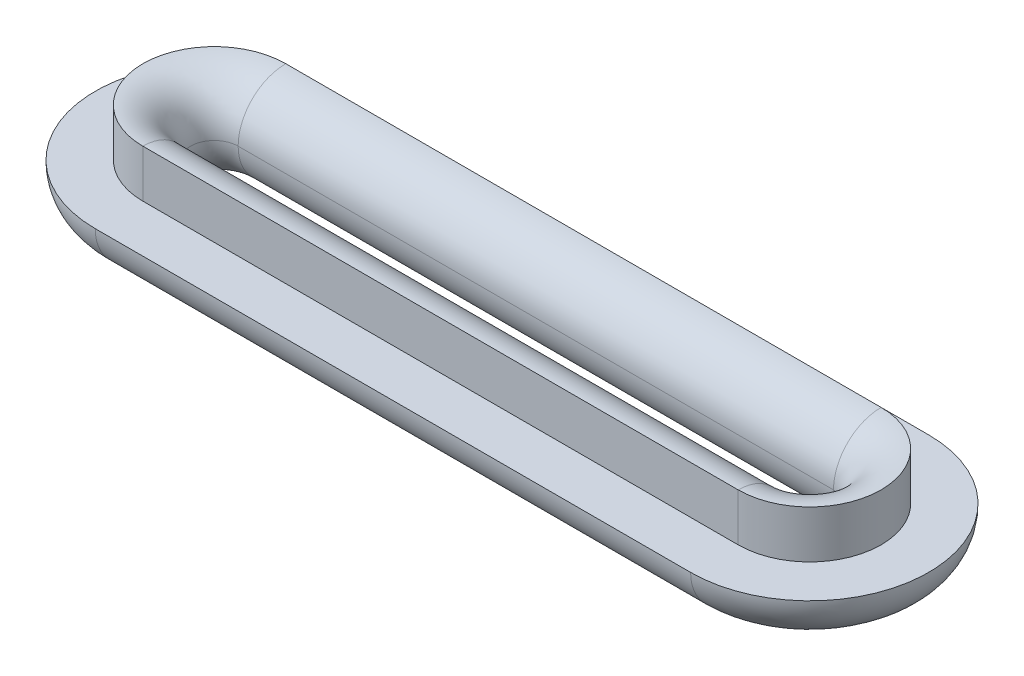
ISO-10303-21;
HEADER;
FILE_DESCRIPTION(('STEP AP214'),'2;1');
FILE_NAME('part.step','',(''),(''),'','','');
FILE_SCHEMA(('AUTOMOTIVE_DESIGN { 1 0 10303 214 1 1 1 1 }'));
ENDSEC;
DATA;
#1=APPLICATION_CONTEXT('core data for automotive mechanical design processes');
#2=APPLICATION_PROTOCOL_DEFINITION('international standard','automotive_design',2000,#1);
#3=PRODUCT_CONTEXT('',#1,'mechanical');
#4=PRODUCT('Part','Part','',(#3));
#5=PRODUCT_RELATED_PRODUCT_CATEGORY('part','',(#4));
#6=PRODUCT_DEFINITION_FORMATION('','',#4);
#7=PRODUCT_DEFINITION_CONTEXT('part definition',#1,'design');
#8=PRODUCT_DEFINITION('design','',#6,#7);
#9=PRODUCT_DEFINITION_SHAPE('','',#8);
#10=(LENGTH_UNIT() NAMED_UNIT(*) SI_UNIT(.MILLI.,.METRE.));
#11=(NAMED_UNIT(*) PLANE_ANGLE_UNIT() SI_UNIT($,.RADIAN.));
#12=(NAMED_UNIT(*) SI_UNIT($,.STERADIAN.) SOLID_ANGLE_UNIT());
#13=UNCERTAINTY_MEASURE_WITH_UNIT(LENGTH_MEASURE(1.E-05),#10,'distance_accuracy_value','');
#14=(GEOMETRIC_REPRESENTATION_CONTEXT(3) GLOBAL_UNCERTAINTY_ASSIGNED_CONTEXT((#13)) GLOBAL_UNIT_ASSIGNED_CONTEXT((#10,
#11,#12)) REPRESENTATION_CONTEXT('',''));
#15=CARTESIAN_POINT('',(0.,0.,0.));
#16=DIRECTION('',(0.,0.,1.));
#17=DIRECTION('',(1.,0.,0.));
#18=AXIS2_PLACEMENT_3D('',#15,#16,#17);
#19=CARTESIAN_POINT('',(-12.5,2.,0.));
#20=DIRECTION('',(0.,-1.,0.));
#21=DIRECTION('',(0.,0.,-1.));
#22=AXIS2_PLACEMENT_3D('',#19,#20,#21);
#23=CYLINDRICAL_SURFACE('',#22,3.);
#24=CARTESIAN_POINT('',(-12.5,0.,0.));
#25=DIRECTION('',(0.,1.,0.));
#26=DIRECTION('',(0.,0.,1.));
#27=AXIS2_PLACEMENT_3D('',#24,#25,#26);
#28=CIRCLE('',#27,3.);
#29=CARTESIAN_POINT('',(-12.5,0.,-3.));
#30=VERTEX_POINT('',#29);
#31=CARTESIAN_POINT('',(-12.5,0.,3.));
#32=VERTEX_POINT('',#31);
#33=EDGE_CURVE('E270',#30,#32,#28,.T.);
#34=ORIENTED_EDGE('',*,*,#33,.T.);
#35=DIRECTION('',(0.,-1.,0.));
#36=VECTOR('',#35,1.);
#37=CARTESIAN_POINT('',(-12.5,2.,3.));
#38=LINE('',#37,#36);
#39=CARTESIAN_POINT('',(-12.5,2.,3.));
#40=VERTEX_POINT('',#39);
#41=EDGE_CURVE('E12',#40,#32,#38,.T.);
#42=ORIENTED_EDGE('',*,*,#41,.F.);
#43=CARTESIAN_POINT('',(-12.5,2.,0.));
#44=DIRECTION('',(0.,1.,0.));
#45=DIRECTION('',(0.,0.,1.));
#46=AXIS2_PLACEMENT_3D('',#43,#44,#45);
#47=CIRCLE('',#46,3.);
#48=CARTESIAN_POINT('',(-12.5,2.,-3.));
#49=VERTEX_POINT('',#48);
#50=EDGE_CURVE('E271',#49,#40,#47,.T.);
#51=ORIENTED_EDGE('',*,*,#50,.F.);
#52=DIRECTION('',(0.,-1.,0.));
#53=VECTOR('',#52,1.);
#54=CARTESIAN_POINT('',(-12.5,2.,-3.));
#55=LINE('',#54,#53);
#56=EDGE_CURVE('E172',#49,#30,#55,.T.);
#57=ORIENTED_EDGE('',*,*,#56,.T.);
#58=EDGE_LOOP('',(#34,#42,#51,#57));
#59=FACE_BOUND('',#58,.T.);
#60=ADVANCED_FACE('F64',(#59),#23,.T.);
#61=CARTESIAN_POINT('',(-12.5,2.,3.));
#62=DIRECTION('',(0.,0.,-1.));
#63=DIRECTION('',(-1.,0.,0.));
#64=AXIS2_PLACEMENT_3D('',#61,#62,#63);
#65=PLANE('',#64);
#66=DIRECTION('',(1.,0.,0.));
#67=VECTOR('',#66,1.);
#68=CARTESIAN_POINT('',(-12.5,0.,3.));
#69=LINE('',#68,#67);
#70=CARTESIAN_POINT('',(12.5,0.,3.));
#71=VERTEX_POINT('',#70);
#72=EDGE_CURVE('E280',#32,#71,#69,.T.);
#73=ORIENTED_EDGE('',*,*,#72,.T.);
#74=DIRECTION('',(0.,-1.,0.));
#75=VECTOR('',#74,1.);
#76=CARTESIAN_POINT('',(12.5,2.,3.));
#77=LINE('',#76,#75);
#78=CARTESIAN_POINT('',(12.5,2.,3.));
#79=VERTEX_POINT('',#78);
#80=EDGE_CURVE('E75',#79,#71,#77,.T.);
#81=ORIENTED_EDGE('',*,*,#80,.F.);
#82=DIRECTION('',(1.,0.,0.));
#83=VECTOR('',#82,1.);
#84=CARTESIAN_POINT('',(-12.5,2.,3.));
#85=LINE('',#84,#83);
#86=EDGE_CURVE('E192',#40,#79,#85,.T.);
#87=ORIENTED_EDGE('',*,*,#86,.F.);
#88=ORIENTED_EDGE('',*,*,#41,.T.);
#89=EDGE_LOOP('',(#73,#81,#87,#88));
#90=FACE_BOUND('',#89,.T.);
#91=ADVANCED_FACE('F290',(#90),#65,.F.);
#92=CARTESIAN_POINT('',(12.5,2.,0.));
#93=DIRECTION('',(0.,-1.,0.));
#94=DIRECTION('',(0.,0.,-1.));
#95=AXIS2_PLACEMENT_3D('',#92,#93,#94);
#96=CYLINDRICAL_SURFACE('',#95,3.);
#97=CARTESIAN_POINT('',(12.5,0.,0.));
#98=DIRECTION('',(0.,1.,0.));
#99=DIRECTION('',(0.,0.,1.));
#100=AXIS2_PLACEMENT_3D('',#97,#98,#99);
#101=CIRCLE('',#100,3.);
#102=CARTESIAN_POINT('',(12.5,0.,-3.));
#103=VERTEX_POINT('',#102);
#104=EDGE_CURVE('E169',#71,#103,#101,.T.);
#105=ORIENTED_EDGE('',*,*,#104,.T.);
#106=DIRECTION('',(0.,-1.,0.));
#107=VECTOR('',#106,1.);
#108=CARTESIAN_POINT('',(12.5,2.,-3.));
#109=LINE('',#108,#107);
#110=CARTESIAN_POINT('',(12.5,2.,-3.));
#111=VERTEX_POINT('',#110);
#112=EDGE_CURVE('E163',#111,#103,#109,.T.);
#113=ORIENTED_EDGE('',*,*,#112,.F.);
#114=CARTESIAN_POINT('',(12.5,2.,0.));
#115=DIRECTION('',(0.,1.,0.));
#116=DIRECTION('',(0.,0.,1.));
#117=AXIS2_PLACEMENT_3D('',#114,#115,#116);
#118=CIRCLE('',#117,3.);
#119=EDGE_CURVE('E168',#79,#111,#118,.T.);
#120=ORIENTED_EDGE('',*,*,#119,.F.);
#121=ORIENTED_EDGE('',*,*,#80,.T.);
#122=EDGE_LOOP('',(#105,#113,#120,#121));
#123=FACE_BOUND('',#122,.T.);
#124=ADVANCED_FACE('F165',(#123),#96,.T.);
#125=CARTESIAN_POINT('',(-12.5,2.,-3.));
#126=DIRECTION('',(0.,0.,1.));
#127=DIRECTION('',(1.,0.,0.));
#128=AXIS2_PLACEMENT_3D('',#125,#126,#127);
#129=PLANE('',#128);
#130=DIRECTION('',(-1.,0.,0.));
#131=VECTOR('',#130,1.);
#132=CARTESIAN_POINT('',(-12.5,0.,-3.));
#133=LINE('',#132,#131);
#134=EDGE_CURVE('E275',#103,#30,#133,.T.);
#135=ORIENTED_EDGE('',*,*,#134,.T.);
#136=ORIENTED_EDGE('',*,*,#56,.F.);
#137=DIRECTION('',(-1.,0.,0.));
#138=VECTOR('',#137,1.);
#139=CARTESIAN_POINT('',(-12.5,2.,-3.));
#140=LINE('',#139,#138);
#141=EDGE_CURVE('E175',#111,#49,#140,.T.);
#142=ORIENTED_EDGE('',*,*,#141,.F.);
#143=ORIENTED_EDGE('',*,*,#112,.T.);
#144=EDGE_LOOP('',(#135,#136,#142,#143));
#145=FACE_BOUND('',#144,.T.);
#146=ADVANCED_FACE('F176',(#145),#129,.F.);
#147=CARTESIAN_POINT('',(-12.5,0.,0.));
#148=DIRECTION('',(0.,1.,0.));
#149=DIRECTION('',(0.,0.,1.));
#150=AXIS2_PLACEMENT_3D('',#147,#148,#149);
#151=TOROIDAL_SURFACE('',#150,3.,2.);
#152=CARTESIAN_POINT('',(-12.5,0.,-3.));
#153=DIRECTION('',(1.,0.,0.));
#154=DIRECTION('',(0.,0.,-1.));
#155=AXIS2_PLACEMENT_3D('',#152,#153,#154);
#156=CIRCLE('',#155,2.);
#157=CARTESIAN_POINT('',(-12.5,0.,-1.));
#158=VERTEX_POINT('',#157);
#159=EDGE_CURVE('E198',#49,#158,#156,.T.);
#160=ORIENTED_EDGE('',*,*,#159,.F.);
#161=ORIENTED_EDGE('',*,*,#50,.T.);
#162=CARTESIAN_POINT('',(-12.5,0.,3.));
#163=DIRECTION('',(1.,0.,0.));
#164=DIRECTION('',(0.,0.,-1.));
#165=AXIS2_PLACEMENT_3D('',#162,#163,#164);
#166=CIRCLE('',#165,2.);
#167=CARTESIAN_POINT('',(-12.5,0.,1.));
#168=VERTEX_POINT('',#167);
#169=EDGE_CURVE('E208',#168,#40,#166,.T.);
#170=ORIENTED_EDGE('',*,*,#169,.F.);
#171=CARTESIAN_POINT('',(-12.5,0.,0.));
#172=DIRECTION('',(0.,1.,0.));
#173=DIRECTION('',(1.,0.,0.));
#174=AXIS2_PLACEMENT_3D('',#171,#172,#173);
#175=CIRCLE('',#174,1.);
#176=EDGE_CURVE('E212',#158,#168,#175,.T.);
#177=ORIENTED_EDGE('',*,*,#176,.F.);
#178=EDGE_LOOP('',(#160,#161,#170,#177));
#179=FACE_BOUND('',#178,.T.);
#180=ADVANCED_FACE('F299',(#179),#151,.T.);
#181=CARTESIAN_POINT('',(-12.5,0.,3.));
#182=DIRECTION('',(1.,0.,0.));
#183=DIRECTION('',(0.,0.,-1.));
#184=AXIS2_PLACEMENT_3D('',#181,#182,#183);
#185=CYLINDRICAL_SURFACE('',#184,2.);
#186=ORIENTED_EDGE('',*,*,#169,.T.);
#187=ORIENTED_EDGE('',*,*,#86,.T.);
#188=CARTESIAN_POINT('',(12.5,0.,3.));
#189=DIRECTION('',(1.,0.,0.));
#190=DIRECTION('',(0.,0.,-1.));
#191=AXIS2_PLACEMENT_3D('',#188,#189,#190);
#192=CIRCLE('',#191,2.);
#193=CARTESIAN_POINT('',(12.5,0.,1.));
#194=VERTEX_POINT('',#193);
#195=EDGE_CURVE('E190',#194,#79,#192,.T.);
#196=ORIENTED_EDGE('',*,*,#195,.F.);
#197=DIRECTION('',(1.,0.,0.));
#198=VECTOR('',#197,1.);
#199=CARTESIAN_POINT('',(-12.5,0.,1.));
#200=LINE('',#199,#198);
#201=EDGE_CURVE('E262',#168,#194,#200,.T.);
#202=ORIENTED_EDGE('',*,*,#201,.F.);
#203=EDGE_LOOP('',(#186,#187,#196,#202));
#204=FACE_BOUND('',#203,.T.);
#205=ADVANCED_FACE('F336',(#204),#185,.T.);
#206=CARTESIAN_POINT('',(-12.5,0.,-3.));
#207=DIRECTION('',(-1.,0.,0.));
#208=DIRECTION('',(0.,0.,1.));
#209=AXIS2_PLACEMENT_3D('',#206,#207,#208);
#210=CYLINDRICAL_SURFACE('',#209,2.);
#211=ORIENTED_EDGE('',*,*,#159,.T.);
#212=DIRECTION('',(-1.,0.,0.));
#213=VECTOR('',#212,1.);
#214=CARTESIAN_POINT('',(-12.5,0.,-1.));
#215=LINE('',#214,#213);
#216=CARTESIAN_POINT('',(12.5,0.,-1.));
#217=VERTEX_POINT('',#216);
#218=EDGE_CURVE('E195',#217,#158,#215,.T.);
#219=ORIENTED_EDGE('',*,*,#218,.F.);
#220=CARTESIAN_POINT('',(12.5,0.,-3.));
#221=DIRECTION('',(1.,0.,0.));
#222=DIRECTION('',(0.,0.,-1.));
#223=AXIS2_PLACEMENT_3D('',#220,#221,#222);
#224=CIRCLE('',#223,2.);
#225=EDGE_CURVE('E188',#111,#217,#224,.T.);
#226=ORIENTED_EDGE('',*,*,#225,.F.);
#227=ORIENTED_EDGE('',*,*,#141,.T.);
#228=EDGE_LOOP('',(#211,#219,#226,#227));
#229=FACE_BOUND('',#228,.T.);
#230=ADVANCED_FACE('F194',(#229),#210,.T.);
#231=CARTESIAN_POINT('',(12.5,0.,0.));
#232=DIRECTION('',(0.,1.,0.));
#233=DIRECTION('',(0.,0.,1.));
#234=AXIS2_PLACEMENT_3D('',#231,#232,#233);
#235=TOROIDAL_SURFACE('',#234,3.,2.);
#236=ORIENTED_EDGE('',*,*,#195,.T.);
#237=ORIENTED_EDGE('',*,*,#119,.T.);
#238=ORIENTED_EDGE('',*,*,#225,.T.);
#239=CARTESIAN_POINT('',(12.5,0.,0.));
#240=DIRECTION('',(0.,1.,0.));
#241=DIRECTION('',(1.,0.,0.));
#242=AXIS2_PLACEMENT_3D('',#239,#240,#241);
#243=CIRCLE('',#242,1.);
#244=EDGE_CURVE('E266',#194,#217,#243,.T.);
#245=ORIENTED_EDGE('',*,*,#244,.F.);
#246=EDGE_LOOP('',(#236,#237,#238,#245));
#247=FACE_BOUND('',#246,.T.);
#248=ADVANCED_FACE('F186',(#247),#235,.T.);
#249=CARTESIAN_POINT('',(12.5,0.,0.));
#250=DIRECTION('',(0.,-1.,0.));
#251=DIRECTION('',(0.,0.,-1.));
#252=AXIS2_PLACEMENT_3D('',#249,#250,#251);
#253=PLANE('',#252);
#254=CARTESIAN_POINT('',(12.5,0.,0.));
#255=DIRECTION('',(0.,-1.,0.));
#256=DIRECTION('',(0.,0.,-1.));
#257=AXIS2_PLACEMENT_3D('',#254,#255,#256);
#258=CIRCLE('',#257,5.);
#259=CARTESIAN_POINT('',(12.5,0.,-5.));
#260=VERTEX_POINT('',#259);
#261=CARTESIAN_POINT('',(12.5,0.,5.));
#262=VERTEX_POINT('',#261);
#263=EDGE_CURVE('E252',#260,#262,#258,.T.);
#264=ORIENTED_EDGE('',*,*,#263,.F.);
#265=DIRECTION('',(1.,0.,0.));
#266=VECTOR('',#265,1.);
#267=CARTESIAN_POINT('',(12.5,0.,-5.));
#268=LINE('',#267,#266);
#269=CARTESIAN_POINT('',(-12.5,0.,-5.));
#270=VERTEX_POINT('',#269);
#271=EDGE_CURVE('E196',#270,#260,#268,.T.);
#272=ORIENTED_EDGE('',*,*,#271,.F.);
#273=CARTESIAN_POINT('',(-12.5,0.,0.));
#274=DIRECTION('',(0.,-1.,0.));
#275=DIRECTION('',(0.,0.,-1.));
#276=AXIS2_PLACEMENT_3D('',#273,#274,#275);
#277=CIRCLE('',#276,5.);
#278=CARTESIAN_POINT('',(-12.5,0.,5.00000000000001));
#279=VERTEX_POINT('',#278);
#280=EDGE_CURVE('E202',#279,#270,#277,.T.);
#281=ORIENTED_EDGE('',*,*,#280,.F.);
#282=DIRECTION('',(-1.,0.,0.));
#283=VECTOR('',#282,1.);
#284=CARTESIAN_POINT('',(-12.5,0.,5.00000000000001));
#285=LINE('',#284,#283);
#286=EDGE_CURVE('E123',#262,#279,#285,.T.);
#287=ORIENTED_EDGE('',*,*,#286,.F.);
#288=EDGE_LOOP('',(#264,#272,#281,#287));
#289=FACE_BOUND('',#288,.T.);
#290=ORIENTED_EDGE('',*,*,#72,.F.);
#291=ORIENTED_EDGE('',*,*,#33,.F.);
#292=ORIENTED_EDGE('',*,*,#134,.F.);
#293=ORIENTED_EDGE('',*,*,#104,.F.);
#294=EDGE_LOOP('',(#290,#291,#292,#293));
#295=FACE_BOUND('',#294,.T.);
#296=ADVANCED_FACE('F294',(#289,#295),#253,.F.);
#297=CARTESIAN_POINT('',(12.5,0.,0.));
#298=DIRECTION('',(0.,-1.,0.));
#299=DIRECTION('',(0.,0.,-1.));
#300=AXIS2_PLACEMENT_3D('',#297,#298,#299);
#301=TOROIDAL_SURFACE('',#300,3.,2.);
#302=CARTESIAN_POINT('',(12.5,0.,-3.));
#303=DIRECTION('',(-1.,0.,0.));
#304=DIRECTION('',(0.,0.,1.));
#305=AXIS2_PLACEMENT_3D('',#302,#303,#304);
#306=CIRCLE('',#305,2.);
#307=CARTESIAN_POINT('',(12.5,-2.,-3.));
#308=VERTEX_POINT('',#307);
#309=EDGE_CURVE('E244',#260,#308,#306,.T.);
#310=ORIENTED_EDGE('',*,*,#309,.F.);
#311=ORIENTED_EDGE('',*,*,#263,.T.);
#312=CARTESIAN_POINT('',(12.5,0.,3.));
#313=DIRECTION('',(-1.,0.,0.));
#314=DIRECTION('',(0.,0.,1.));
#315=AXIS2_PLACEMENT_3D('',#312,#313,#314);
#316=CIRCLE('',#315,2.);
#317=CARTESIAN_POINT('',(12.5,-2.,3.));
#318=VERTEX_POINT('',#317);
#319=EDGE_CURVE('E68',#318,#262,#316,.T.);
#320=ORIENTED_EDGE('',*,*,#319,.F.);
#321=CARTESIAN_POINT('',(12.5,-2.,0.));
#322=DIRECTION('',(0.,-1.,0.));
#323=DIRECTION('',(0.,0.,-1.));
#324=AXIS2_PLACEMENT_3D('',#321,#322,#323);
#325=CIRCLE('',#324,3.);
#326=EDGE_CURVE('E109',#308,#318,#325,.T.);
#327=ORIENTED_EDGE('',*,*,#326,.F.);
#328=EDGE_LOOP('',(#310,#311,#320,#327));
#329=FACE_BOUND('',#328,.T.);
#330=ADVANCED_FACE('F66',(#329),#301,.T.);
#331=CARTESIAN_POINT('',(12.5,0.,3.));
#332=DIRECTION('',(1.,0.,0.));
#333=DIRECTION('',(0.,0.,-1.));
#334=AXIS2_PLACEMENT_3D('',#331,#332,#333);
#335=CYLINDRICAL_SURFACE('',#334,2.);
#336=ORIENTED_EDGE('',*,*,#319,.T.);
#337=ORIENTED_EDGE('',*,*,#286,.T.);
#338=CARTESIAN_POINT('',(-12.5,0.,3.00000000000001));
#339=DIRECTION('',(-1.,0.,0.));
#340=DIRECTION('',(0.,0.,1.));
#341=AXIS2_PLACEMENT_3D('',#338,#339,#340);
#342=CIRCLE('',#341,2.);
#343=CARTESIAN_POINT('',(-12.5,-2.,3.));
#344=VERTEX_POINT('',#343);
#345=EDGE_CURVE('E237',#344,#279,#342,.T.);
#346=ORIENTED_EDGE('',*,*,#345,.F.);
#347=DIRECTION('',(-1.,0.,0.));
#348=VECTOR('',#347,1.);
#349=CARTESIAN_POINT('',(-12.5,-2.,3.00000000000001));
#350=LINE('',#349,#348);
#351=EDGE_CURVE('E233',#318,#344,#350,.T.);
#352=ORIENTED_EDGE('',*,*,#351,.F.);
#353=EDGE_LOOP('',(#336,#337,#346,#352));
#354=FACE_BOUND('',#353,.T.);
#355=ADVANCED_FACE('F317',(#354),#335,.T.);
#356=CARTESIAN_POINT('',(12.5,0.,0.));
#357=DIRECTION('',(0.,-1.,0.));
#358=DIRECTION('',(0.,0.,-1.));
#359=AXIS2_PLACEMENT_3D('',#356,#357,#358);
#360=TOROIDAL_SURFACE('',#359,3.,2.);
#361=CARTESIAN_POINT('',(12.5,0.,-3.));
#362=DIRECTION('',(-1.,0.,0.));
#363=DIRECTION('',(0.,0.,1.));
#364=AXIS2_PLACEMENT_3D('',#361,#362,#363);
#365=CIRCLE('',#364,2.);
#366=EDGE_CURVE('E226',#308,#217,#365,.T.);
#367=ORIENTED_EDGE('',*,*,#366,.F.);
#368=ORIENTED_EDGE('',*,*,#326,.T.);
#369=CARTESIAN_POINT('',(12.5,0.,3.));
#370=DIRECTION('',(-1.,0.,0.));
#371=DIRECTION('',(0.,0.,1.));
#372=AXIS2_PLACEMENT_3D('',#369,#370,#371);
#373=CIRCLE('',#372,2.);
#374=EDGE_CURVE('E229',#194,#318,#373,.T.);
#375=ORIENTED_EDGE('',*,*,#374,.F.);
#376=ORIENTED_EDGE('',*,*,#244,.T.);
#377=EDGE_LOOP('',(#367,#368,#375,#376));
#378=FACE_BOUND('',#377,.T.);
#379=ADVANCED_FACE('F315',(#378),#360,.T.);
#380=CARTESIAN_POINT('',(12.5,0.,-3.));
#381=DIRECTION('',(-1.,0.,0.));
#382=DIRECTION('',(0.,0.,1.));
#383=AXIS2_PLACEMENT_3D('',#380,#381,#382);
#384=CYLINDRICAL_SURFACE('',#383,2.);
#385=CARTESIAN_POINT('',(-12.5,0.,-3.));
#386=DIRECTION('',(-1.,0.,0.));
#387=DIRECTION('',(0.,0.,1.));
#388=AXIS2_PLACEMENT_3D('',#385,#386,#387);
#389=CIRCLE('',#388,2.);
#390=CARTESIAN_POINT('',(-12.5,-2.,-3.));
#391=VERTEX_POINT('',#390);
#392=EDGE_CURVE('E241',#270,#391,#389,.T.);
#393=ORIENTED_EDGE('',*,*,#392,.F.);
#394=ORIENTED_EDGE('',*,*,#271,.T.);
#395=ORIENTED_EDGE('',*,*,#309,.T.);
#396=DIRECTION('',(1.,0.,0.));
#397=VECTOR('',#396,1.);
#398=CARTESIAN_POINT('',(12.5,-2.,-3.));
#399=LINE('',#398,#397);
#400=EDGE_CURVE('E222',#391,#308,#399,.T.);
#401=ORIENTED_EDGE('',*,*,#400,.F.);
#402=EDGE_LOOP('',(#393,#394,#395,#401));
#403=FACE_BOUND('',#402,.T.);
#404=ADVANCED_FACE('F312',(#403),#384,.T.);
#405=CARTESIAN_POINT('',(-12.5,0.,0.));
#406=DIRECTION('',(0.,-1.,0.));
#407=DIRECTION('',(0.,0.,-1.));
#408=AXIS2_PLACEMENT_3D('',#405,#406,#407);
#409=TOROIDAL_SURFACE('',#408,3.,2.);
#410=ORIENTED_EDGE('',*,*,#280,.T.);
#411=ORIENTED_EDGE('',*,*,#392,.T.);
#412=CARTESIAN_POINT('',(-12.5,-2.,0.));
#413=DIRECTION('',(0.,-1.,0.));
#414=DIRECTION('',(0.,0.,-1.));
#415=AXIS2_PLACEMENT_3D('',#412,#413,#414);
#416=CIRCLE('',#415,3.);
#417=EDGE_CURVE('E219',#344,#391,#416,.T.);
#418=ORIENTED_EDGE('',*,*,#417,.F.);
#419=ORIENTED_EDGE('',*,*,#345,.T.);
#420=EDGE_LOOP('',(#410,#411,#418,#419));
#421=FACE_BOUND('',#420,.T.);
#422=ADVANCED_FACE('F307',(#421),#409,.T.);
#423=CARTESIAN_POINT('',(-12.5,0.,3.));
#424=DIRECTION('',(-1.,0.,0.));
#425=DIRECTION('',(0.,0.,1.));
#426=AXIS2_PLACEMENT_3D('',#423,#424,#425);
#427=CYLINDRICAL_SURFACE('',#426,2.);
#428=ORIENTED_EDGE('',*,*,#374,.T.);
#429=ORIENTED_EDGE('',*,*,#351,.T.);
#430=CARTESIAN_POINT('',(-12.5,0.,3.));
#431=DIRECTION('',(-1.,0.,0.));
#432=DIRECTION('',(0.,0.,1.));
#433=AXIS2_PLACEMENT_3D('',#430,#431,#432);
#434=CIRCLE('',#433,2.);
#435=EDGE_CURVE('E215',#168,#344,#434,.T.);
#436=ORIENTED_EDGE('',*,*,#435,.F.);
#437=ORIENTED_EDGE('',*,*,#201,.T.);
#438=EDGE_LOOP('',(#428,#429,#436,#437));
#439=FACE_BOUND('',#438,.T.);
#440=ADVANCED_FACE('F305',(#439),#427,.T.);
#441=CARTESIAN_POINT('',(12.5,0.,-3.));
#442=DIRECTION('',(1.,0.,0.));
#443=DIRECTION('',(0.,0.,-1.));
#444=AXIS2_PLACEMENT_3D('',#441,#442,#443);
#445=CYLINDRICAL_SURFACE('',#444,2.);
#446=ORIENTED_EDGE('',*,*,#366,.T.);
#447=ORIENTED_EDGE('',*,*,#218,.T.);
#448=CARTESIAN_POINT('',(-12.5,0.,-3.));
#449=DIRECTION('',(-1.,0.,0.));
#450=DIRECTION('',(0.,0.,1.));
#451=AXIS2_PLACEMENT_3D('',#448,#449,#450);
#452=CIRCLE('',#451,2.);
#453=EDGE_CURVE('E87',#391,#158,#452,.T.);
#454=ORIENTED_EDGE('',*,*,#453,.F.);
#455=ORIENTED_EDGE('',*,*,#400,.T.);
#456=EDGE_LOOP('',(#446,#447,#454,#455));
#457=FACE_BOUND('',#456,.T.);
#458=ADVANCED_FACE('F314',(#457),#445,.T.);
#459=CARTESIAN_POINT('',(-12.5,0.,0.));
#460=DIRECTION('',(0.,-1.,0.));
#461=DIRECTION('',(0.,0.,-1.));
#462=AXIS2_PLACEMENT_3D('',#459,#460,#461);
#463=TOROIDAL_SURFACE('',#462,3.,2.);
#464=ORIENTED_EDGE('',*,*,#435,.T.);
#465=ORIENTED_EDGE('',*,*,#417,.T.);
#466=ORIENTED_EDGE('',*,*,#453,.T.);
#467=ORIENTED_EDGE('',*,*,#176,.T.);
#468=EDGE_LOOP('',(#464,#465,#466,#467));
#469=FACE_BOUND('',#468,.T.);
#470=ADVANCED_FACE('F301',(#469),#463,.T.);
#471=CLOSED_SHELL('',(#60,#91,#124,#146,#180,#205,#230,#248,#296,#330,#355,#379,#404,#422,#440,
#458,#470));
#472=MANIFOLD_SOLID_BREP('B2',#471);
#473=ADVANCED_BREP_SHAPE_REPRESENTATION('',(#18,#472),#14);
#474=SHAPE_DEFINITION_REPRESENTATION(#9,#473);
ENDSEC;
END-ISO-10303-21;
